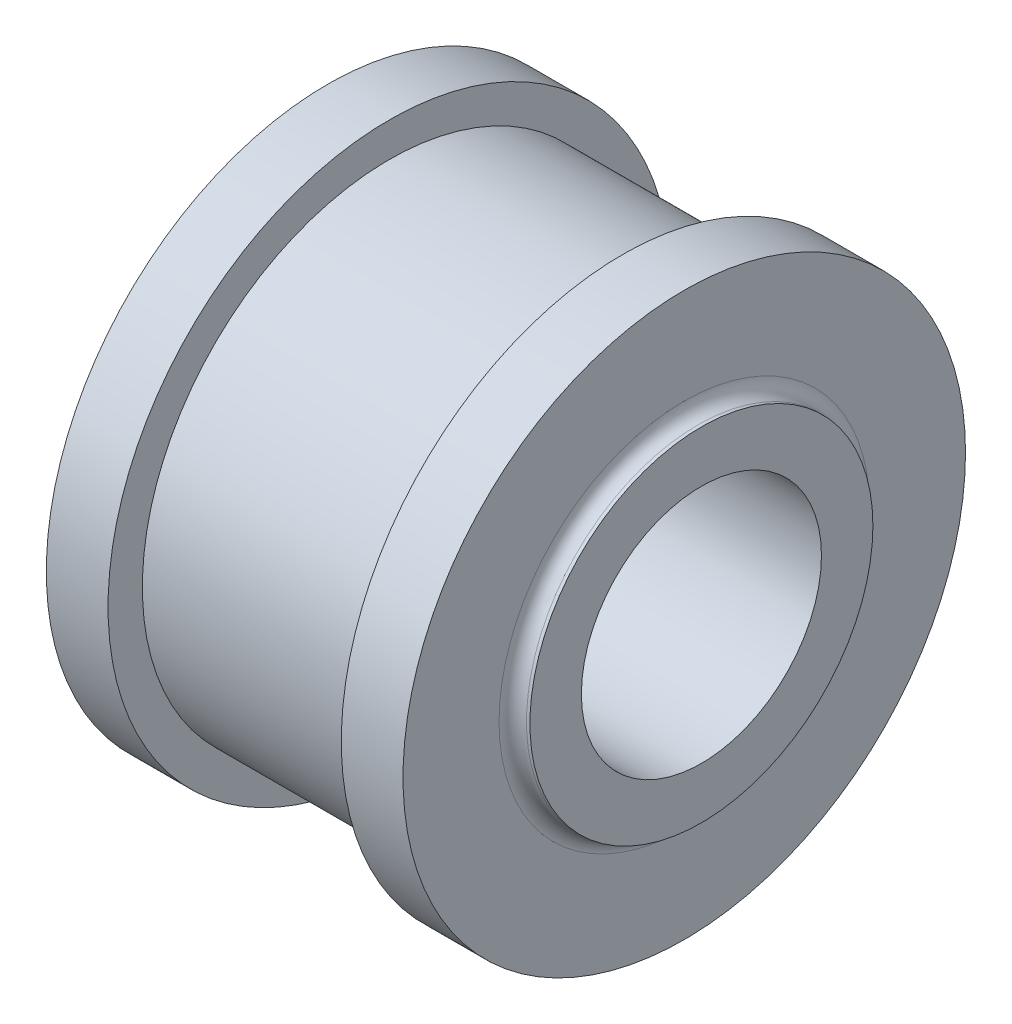
ISO-10303-21;
HEADER;
FILE_DESCRIPTION(('STEP AP214'),'2;1');
FILE_NAME('part.step','',(''),(''),'','','');
FILE_SCHEMA(('AUTOMOTIVE_DESIGN { 1 0 10303 214 1 1 1 1 }'));
ENDSEC;
DATA;
#1=APPLICATION_CONTEXT('core data for automotive mechanical design processes');
#2=APPLICATION_PROTOCOL_DEFINITION('international standard','automotive_design',2000,#1);
#3=PRODUCT_CONTEXT('',#1,'mechanical');
#4=PRODUCT('Part','Part','',(#3));
#5=PRODUCT_RELATED_PRODUCT_CATEGORY('part','',(#4));
#6=PRODUCT_DEFINITION_FORMATION('','',#4);
#7=PRODUCT_DEFINITION_CONTEXT('part definition',#1,'design');
#8=PRODUCT_DEFINITION('design','',#6,#7);
#9=PRODUCT_DEFINITION_SHAPE('','',#8);
#10=(LENGTH_UNIT() NAMED_UNIT(*) SI_UNIT(.MILLI.,.METRE.));
#11=(NAMED_UNIT(*) PLANE_ANGLE_UNIT() SI_UNIT($,.RADIAN.));
#12=(NAMED_UNIT(*) SI_UNIT($,.STERADIAN.) SOLID_ANGLE_UNIT());
#13=UNCERTAINTY_MEASURE_WITH_UNIT(LENGTH_MEASURE(1.E-05),#10,'distance_accuracy_value','');
#14=(GEOMETRIC_REPRESENTATION_CONTEXT(3) GLOBAL_UNCERTAINTY_ASSIGNED_CONTEXT((#13)) GLOBAL_UNIT_ASSIGNED_CONTEXT((#10,
#11,#12)) REPRESENTATION_CONTEXT('',''));
#15=CARTESIAN_POINT('',(0.,0.,0.));
#16=DIRECTION('',(0.,0.,1.));
#17=DIRECTION('',(1.,0.,0.));
#18=AXIS2_PLACEMENT_3D('',#15,#16,#17);
#19=CARTESIAN_POINT('',(27.5209223538506,-33.6101916856441,0.));
#20=DIRECTION('',(1.,0.,0.));
#21=DIRECTION('',(0.,0.,-1.));
#22=AXIS2_PLACEMENT_3D('',#19,#20,#21);
#23=CYLINDRICAL_SURFACE('',#22,17.5);
#24=CARTESIAN_POINT('',(28.229021503584,-33.6101916856441,0.));
#25=DIRECTION('',(1.,0.,0.));
#26=DIRECTION('',(0.,0.,-1.));
#27=AXIS2_PLACEMENT_3D('',#24,#25,#26);
#28=CIRCLE('',#27,17.5);
#29=CARTESIAN_POINT('',(28.229021503584,-33.6101916856441,-17.5));
#30=VERTEX_POINT('',#29);
#31=EDGE_CURVE('E52',#30,#30,#28,.T.);
#32=ORIENTED_EDGE('',*,*,#31,.T.);
#33=EDGE_LOOP('',(#32));
#34=FACE_BOUND('',#33,.T.);
#35=CARTESIAN_POINT('',(-28.7709784964161,-33.6101916856441,0.));
#36=DIRECTION('',(1.,0.,0.));
#37=DIRECTION('',(0.,0.,-1.));
#38=AXIS2_PLACEMENT_3D('',#35,#36,#37);
#39=CIRCLE('',#38,17.5);
#40=CARTESIAN_POINT('',(-28.7709784964161,-33.6101916856441,-17.5));
#41=VERTEX_POINT('',#40);
#42=EDGE_CURVE('E79',#41,#41,#39,.T.);
#43=ORIENTED_EDGE('',*,*,#42,.F.);
#44=EDGE_LOOP('',(#43));
#45=FACE_BOUND('',#44,.T.);
#46=ADVANCED_FACE('F32',(#34,#45),#23,.F.);
#47=CARTESIAN_POINT('',(28.229021503584,-16.1101916856441,0.));
#48=DIRECTION('',(1.,0.,0.));
#49=DIRECTION('',(0.,0.,-1.));
#50=AXIS2_PLACEMENT_3D('',#47,#48,#49);
#51=PLANE('',#50);
#52=CARTESIAN_POINT('',(28.2290215035839,-33.6101916856441,0.));
#53=DIRECTION('',(1.,0.,0.));
#54=DIRECTION('',(0.,0.,-1.));
#55=AXIS2_PLACEMENT_3D('',#52,#53,#54);
#56=CIRCLE('',#55,25.);
#57=CARTESIAN_POINT('',(28.2290215035839,-33.6101916856441,-25.));
#58=VERTEX_POINT('',#57);
#59=EDGE_CURVE('E55',#58,#58,#56,.T.);
#60=ORIENTED_EDGE('',*,*,#59,.T.);
#61=EDGE_LOOP('',(#60));
#62=FACE_BOUND('',#61,.T.);
#63=ORIENTED_EDGE('',*,*,#31,.F.);
#64=EDGE_LOOP('',(#63));
#65=FACE_BOUND('',#64,.T.);
#66=ADVANCED_FACE('F87',(#62,#65),#51,.T.);
#67=CARTESIAN_POINT('',(27.5209223538506,-33.6101916856441,0.));
#68=DIRECTION('',(1.,0.,0.));
#69=DIRECTION('',(0.,0.,-1.));
#70=AXIS2_PLACEMENT_3D('',#67,#68,#69);
#71=CYLINDRICAL_SURFACE('',#70,25.);
#72=CARTESIAN_POINT('',(27.7290215035839,-33.6101916856441,0.));
#73=DIRECTION('',(1.,0.,0.));
#74=DIRECTION('',(0.,0.,-1.));
#75=AXIS2_PLACEMENT_3D('',#72,#73,#74);
#76=CIRCLE('',#75,25.);
#77=CARTESIAN_POINT('',(27.7290215035839,-33.6101916856441,-25.));
#78=VERTEX_POINT('',#77);
#79=EDGE_CURVE('E47',#78,#78,#76,.T.);
#80=ORIENTED_EDGE('',*,*,#79,.T.);
#81=EDGE_LOOP('',(#80));
#82=FACE_BOUND('',#81,.T.);
#83=ORIENTED_EDGE('',*,*,#59,.F.);
#84=EDGE_LOOP('',(#83));
#85=FACE_BOUND('',#84,.T.);
#86=ADVANCED_FACE('F93',(#82,#85),#71,.T.);
#87=CARTESIAN_POINT('',(25.7290215035839,-8.61019168564411,0.));
#88=DIRECTION('',(1.,0.,0.));
#89=DIRECTION('',(0.,0.,-1.));
#90=AXIS2_PLACEMENT_3D('',#87,#88,#89);
#91=PLANE('',#90);
#92=CARTESIAN_POINT('',(25.7290215035839,-33.6101916856441,0.));
#93=DIRECTION('',(1.,0.,0.));
#94=DIRECTION('',(0.,0.,-1.));
#95=AXIS2_PLACEMENT_3D('',#92,#93,#94);
#96=CIRCLE('',#95,27.);
#97=CARTESIAN_POINT('',(25.7290215035839,-33.6101916856441,-27.));
#98=VERTEX_POINT('',#97);
#99=EDGE_CURVE('E43',#98,#98,#96,.F.);
#100=ORIENTED_EDGE('',*,*,#99,.T.);
#101=EDGE_LOOP('',(#100));
#102=FACE_BOUND('',#101,.T.);
#103=CARTESIAN_POINT('',(25.7290215035839,-33.6101916856441,0.));
#104=DIRECTION('',(1.,0.,0.));
#105=DIRECTION('',(0.,0.,-1.));
#106=AXIS2_PLACEMENT_3D('',#103,#104,#105);
#107=CIRCLE('',#106,41.);
#108=CARTESIAN_POINT('',(25.7290215035839,-33.6101916856441,-41.));
#109=VERTEX_POINT('',#108);
#110=EDGE_CURVE('E58',#109,#109,#107,.T.);
#111=ORIENTED_EDGE('',*,*,#110,.T.);
#112=EDGE_LOOP('',(#111));
#113=FACE_BOUND('',#112,.T.);
#114=ADVANCED_FACE('F113',(#102,#113),#91,.T.);
#115=CARTESIAN_POINT('',(27.5209223538506,-33.6101916856441,0.));
#116=DIRECTION('',(1.,0.,0.));
#117=DIRECTION('',(0.,0.,-1.));
#118=AXIS2_PLACEMENT_3D('',#115,#116,#117);
#119=CYLINDRICAL_SURFACE('',#118,41.);
#120=CARTESIAN_POINT('',(16.7290215035839,-33.6101916856441,0.));
#121=DIRECTION('',(1.,0.,0.));
#122=DIRECTION('',(0.,0.,-1.));
#123=AXIS2_PLACEMENT_3D('',#120,#121,#122);
#124=CIRCLE('',#123,41.);
#125=CARTESIAN_POINT('',(16.7290215035839,-33.6101916856441,-41.));
#126=VERTEX_POINT('',#125);
#127=EDGE_CURVE('E61',#126,#126,#124,.T.);
#128=ORIENTED_EDGE('',*,*,#127,.T.);
#129=EDGE_LOOP('',(#128));
#130=FACE_BOUND('',#129,.T.);
#131=ORIENTED_EDGE('',*,*,#110,.F.);
#132=EDGE_LOOP('',(#131));
#133=FACE_BOUND('',#132,.T.);
#134=ADVANCED_FACE('F120',(#130,#133),#119,.T.);
#135=CARTESIAN_POINT('',(16.7290215035839,7.38980831435589,0.));
#136=DIRECTION('',(-1.,0.,0.));
#137=DIRECTION('',(0.,0.,1.));
#138=AXIS2_PLACEMENT_3D('',#135,#136,#137);
#139=PLANE('',#138);
#140=CARTESIAN_POINT('',(16.7290215035839,-33.6101916856441,0.));
#141=DIRECTION('',(1.,0.,0.));
#142=DIRECTION('',(0.,0.,-1.));
#143=AXIS2_PLACEMENT_3D('',#140,#141,#142);
#144=CIRCLE('',#143,36.);
#145=CARTESIAN_POINT('',(16.7290215035839,-33.6101916856441,-36.));
#146=VERTEX_POINT('',#145);
#147=EDGE_CURVE('E64',#146,#146,#144,.T.);
#148=ORIENTED_EDGE('',*,*,#147,.T.);
#149=EDGE_LOOP('',(#148));
#150=FACE_BOUND('',#149,.T.);
#151=ORIENTED_EDGE('',*,*,#127,.F.);
#152=EDGE_LOOP('',(#151));
#153=FACE_BOUND('',#152,.T.);
#154=ADVANCED_FACE('F126',(#150,#153),#139,.T.);
#155=CARTESIAN_POINT('',(27.5209223538506,-33.6101916856441,0.));
#156=DIRECTION('',(1.,0.,0.));
#157=DIRECTION('',(0.,0.,-1.));
#158=AXIS2_PLACEMENT_3D('',#155,#156,#157);
#159=CYLINDRICAL_SURFACE('',#158,36.);
#160=CARTESIAN_POINT('',(-17.2709784964161,-33.6101916856441,0.));
#161=DIRECTION('',(1.,0.,0.));
#162=DIRECTION('',(0.,0.,-1.));
#163=AXIS2_PLACEMENT_3D('',#160,#161,#162);
#164=CIRCLE('',#163,36.);
#165=CARTESIAN_POINT('',(-17.2709784964161,-33.6101916856441,-36.));
#166=VERTEX_POINT('',#165);
#167=EDGE_CURVE('E67',#166,#166,#164,.T.);
#168=ORIENTED_EDGE('',*,*,#167,.T.);
#169=EDGE_LOOP('',(#168));
#170=FACE_BOUND('',#169,.T.);
#171=ORIENTED_EDGE('',*,*,#147,.F.);
#172=EDGE_LOOP('',(#171));
#173=FACE_BOUND('',#172,.T.);
#174=ADVANCED_FACE('F130',(#170,#173),#159,.T.);
#175=CARTESIAN_POINT('',(-17.2709784964161,2.38980831435588,0.));
#176=DIRECTION('',(1.,0.,0.));
#177=DIRECTION('',(0.,0.,-1.));
#178=AXIS2_PLACEMENT_3D('',#175,#176,#177);
#179=PLANE('',#178);
#180=CARTESIAN_POINT('',(-17.2709784964161,-33.6101916856441,0.));
#181=DIRECTION('',(1.,0.,0.));
#182=DIRECTION('',(0.,0.,-1.));
#183=AXIS2_PLACEMENT_3D('',#180,#181,#182);
#184=CIRCLE('',#183,41.);
#185=CARTESIAN_POINT('',(-17.2709784964161,-33.6101916856441,-41.));
#186=VERTEX_POINT('',#185);
#187=EDGE_CURVE('E70',#186,#186,#184,.T.);
#188=ORIENTED_EDGE('',*,*,#187,.T.);
#189=EDGE_LOOP('',(#188));
#190=FACE_BOUND('',#189,.T.);
#191=ORIENTED_EDGE('',*,*,#167,.F.);
#192=EDGE_LOOP('',(#191));
#193=FACE_BOUND('',#192,.T.);
#194=ADVANCED_FACE('F134',(#190,#193),#179,.T.);
#195=CARTESIAN_POINT('',(27.5209223538506,-33.6101916856441,0.));
#196=DIRECTION('',(1.,0.,0.));
#197=DIRECTION('',(0.,0.,-1.));
#198=AXIS2_PLACEMENT_3D('',#195,#196,#197);
#199=CYLINDRICAL_SURFACE('',#198,41.);
#200=CARTESIAN_POINT('',(-26.2709784964161,-33.6101916856441,0.));
#201=DIRECTION('',(1.,0.,0.));
#202=DIRECTION('',(0.,0.,-1.));
#203=AXIS2_PLACEMENT_3D('',#200,#201,#202);
#204=CIRCLE('',#203,41.);
#205=CARTESIAN_POINT('',(-26.2709784964161,-33.6101916856441,-41.));
#206=VERTEX_POINT('',#205);
#207=EDGE_CURVE('E73',#206,#206,#204,.T.);
#208=ORIENTED_EDGE('',*,*,#207,.T.);
#209=EDGE_LOOP('',(#208));
#210=FACE_BOUND('',#209,.T.);
#211=ORIENTED_EDGE('',*,*,#187,.F.);
#212=EDGE_LOOP('',(#211));
#213=FACE_BOUND('',#212,.T.);
#214=ADVANCED_FACE('F138',(#210,#213),#199,.T.);
#215=CARTESIAN_POINT('',(-26.2709784964161,7.38980831435589,0.));
#216=DIRECTION('',(-1.,0.,0.));
#217=DIRECTION('',(0.,0.,1.));
#218=AXIS2_PLACEMENT_3D('',#215,#216,#217);
#219=PLANE('',#218);
#220=CARTESIAN_POINT('',(-26.2709784964161,-33.6101916856441,0.));
#221=DIRECTION('',(-1.,0.,0.));
#222=DIRECTION('',(0.,0.,1.));
#223=AXIS2_PLACEMENT_3D('',#220,#221,#222);
#224=CIRCLE('',#223,27.);
#225=CARTESIAN_POINT('',(-26.2709784964161,-33.6101916856441,27.));
#226=VERTEX_POINT('',#225);
#227=EDGE_CURVE('E39',#226,#226,#224,.F.);
#228=ORIENTED_EDGE('',*,*,#227,.T.);
#229=EDGE_LOOP('',(#228));
#230=FACE_BOUND('',#229,.T.);
#231=ORIENTED_EDGE('',*,*,#207,.F.);
#232=EDGE_LOOP('',(#231));
#233=FACE_BOUND('',#232,.T.);
#234=ADVANCED_FACE('F142',(#230,#233),#219,.T.);
#235=CARTESIAN_POINT('',(27.5209223538506,-33.6101916856441,0.));
#236=DIRECTION('',(1.,0.,0.));
#237=DIRECTION('',(0.,0.,-1.));
#238=AXIS2_PLACEMENT_3D('',#235,#236,#237);
#239=CYLINDRICAL_SURFACE('',#238,25.);
#240=CARTESIAN_POINT('',(-28.2709784964161,-33.6101916856441,0.));
#241=DIRECTION('',(-1.,0.,0.));
#242=DIRECTION('',(0.,0.,1.));
#243=AXIS2_PLACEMENT_3D('',#240,#241,#242);
#244=CIRCLE('',#243,25.);
#245=CARTESIAN_POINT('',(-28.2709784964161,-33.6101916856441,25.));
#246=VERTEX_POINT('',#245);
#247=EDGE_CURVE('E10',#246,#246,#244,.T.);
#248=ORIENTED_EDGE('',*,*,#247,.T.);
#249=EDGE_LOOP('',(#248));
#250=FACE_BOUND('',#249,.T.);
#251=CARTESIAN_POINT('',(-28.7709784964161,-33.6101916856441,0.));
#252=DIRECTION('',(1.,0.,0.));
#253=DIRECTION('',(0.,0.,-1.));
#254=AXIS2_PLACEMENT_3D('',#251,#252,#253);
#255=CIRCLE('',#254,25.);
#256=CARTESIAN_POINT('',(-28.7709784964161,-33.6101916856441,-25.));
#257=VERTEX_POINT('',#256);
#258=EDGE_CURVE('E76',#257,#257,#255,.T.);
#259=ORIENTED_EDGE('',*,*,#258,.T.);
#260=EDGE_LOOP('',(#259));
#261=FACE_BOUND('',#260,.T.);
#262=ADVANCED_FACE('F105',(#250,#261),#239,.T.);
#263=CARTESIAN_POINT('',(-28.7709784964161,-8.61019168564411,0.));
#264=DIRECTION('',(-1.,0.,0.));
#265=DIRECTION('',(0.,0.,1.));
#266=AXIS2_PLACEMENT_3D('',#263,#264,#265);
#267=PLANE('',#266);
#268=ORIENTED_EDGE('',*,*,#42,.T.);
#269=EDGE_LOOP('',(#268));
#270=FACE_BOUND('',#269,.T.);
#271=ORIENTED_EDGE('',*,*,#258,.F.);
#272=EDGE_LOOP('',(#271));
#273=FACE_BOUND('',#272,.T.);
#274=ADVANCED_FACE('F83',(#270,#273),#267,.T.);
#275=CARTESIAN_POINT('',(27.7290215035839,-33.6101916856441,0.));
#276=DIRECTION('',(1.,0.,0.));
#277=DIRECTION('',(0.,0.,-1.));
#278=AXIS2_PLACEMENT_3D('',#275,#276,#277);
#279=TOROIDAL_SURFACE('',#278,27.,2.);
#280=ORIENTED_EDGE('',*,*,#99,.F.);
#281=EDGE_LOOP('',(#280));
#282=FACE_BOUND('',#281,.T.);
#283=ORIENTED_EDGE('',*,*,#79,.F.);
#284=EDGE_LOOP('',(#283));
#285=FACE_BOUND('',#284,.T.);
#286=ADVANCED_FACE('F97',(#282,#285),#279,.F.);
#287=CARTESIAN_POINT('',(-28.2709784964161,-33.6101916856441,0.));
#288=DIRECTION('',(-1.,0.,0.));
#289=DIRECTION('',(0.,0.,1.));
#290=AXIS2_PLACEMENT_3D('',#287,#288,#289);
#291=TOROIDAL_SURFACE('',#290,27.,2.);
#292=ORIENTED_EDGE('',*,*,#247,.F.);
#293=EDGE_LOOP('',(#292));
#294=FACE_BOUND('',#293,.T.);
#295=ORIENTED_EDGE('',*,*,#227,.F.);
#296=EDGE_LOOP('',(#295));
#297=FACE_BOUND('',#296,.T.);
#298=ADVANCED_FACE('F34',(#294,#297),#291,.F.);
#299=CLOSED_SHELL('',(#46,#66,#86,#114,#134,#154,#174,#194,#214,#234,#262,#274,#286,#298));
#300=MANIFOLD_SOLID_BREP('B2',#299);
#301=ADVANCED_BREP_SHAPE_REPRESENTATION('',(#18,#300),#14);
#302=SHAPE_DEFINITION_REPRESENTATION(#9,#301);
ENDSEC;
END-ISO-10303-21;
